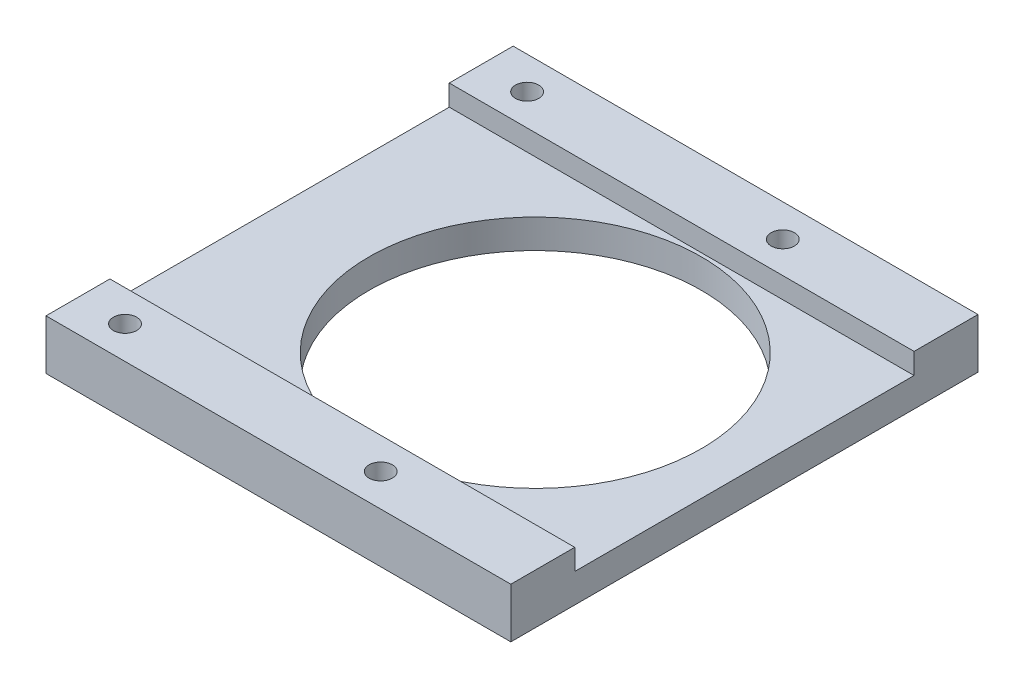
ISO-10303-21;
HEADER;
FILE_DESCRIPTION(('STEP AP214'),'2;1');
FILE_NAME('part.step','',(''),(''),'','','');
FILE_SCHEMA(('AUTOMOTIVE_DESIGN { 1 0 10303 214 1 1 1 1 }'));
ENDSEC;
DATA;
#1=APPLICATION_CONTEXT('core data for automotive mechanical design processes');
#2=APPLICATION_PROTOCOL_DEFINITION('international standard','automotive_design',2000,#1);
#3=PRODUCT_CONTEXT('',#1,'mechanical');
#4=PRODUCT('Part','Part','',(#3));
#5=PRODUCT_RELATED_PRODUCT_CATEGORY('part','',(#4));
#6=PRODUCT_DEFINITION_FORMATION('','',#4);
#7=PRODUCT_DEFINITION_CONTEXT('part definition',#1,'design');
#8=PRODUCT_DEFINITION('design','',#6,#7);
#9=PRODUCT_DEFINITION_SHAPE('','',#8);
#10=(LENGTH_UNIT() NAMED_UNIT(*) SI_UNIT(.MILLI.,.METRE.));
#11=(NAMED_UNIT(*) PLANE_ANGLE_UNIT() SI_UNIT($,.RADIAN.));
#12=(NAMED_UNIT(*) SI_UNIT($,.STERADIAN.) SOLID_ANGLE_UNIT());
#13=UNCERTAINTY_MEASURE_WITH_UNIT(LENGTH_MEASURE(1.E-05),#10,'distance_accuracy_value','');
#14=(GEOMETRIC_REPRESENTATION_CONTEXT(3) GLOBAL_UNCERTAINTY_ASSIGNED_CONTEXT((#13)) GLOBAL_UNIT_ASSIGNED_CONTEXT((#10,
#11,#12)) REPRESENTATION_CONTEXT('',''));
#15=CARTESIAN_POINT('',(0.,0.,0.));
#16=DIRECTION('',(0.,0.,1.));
#17=DIRECTION('',(1.,0.,0.));
#18=AXIS2_PLACEMENT_3D('',#15,#16,#17);
#19=CARTESIAN_POINT('',(0.,2.5,0.));
#20=DIRECTION('',(0.,1.,0.));
#21=DIRECTION('',(0.,0.,1.));
#22=AXIS2_PLACEMENT_3D('',#19,#20,#21);
#23=PLANE('',#22);
#24=CARTESIAN_POINT('',(0.,2.5,0.));
#25=DIRECTION('',(0.,1.,0.));
#26=DIRECTION('',(0.,0.,1.));
#27=AXIS2_PLACEMENT_3D('',#24,#25,#26);
#28=CIRCLE('',#27,14.3);
#29=CARTESIAN_POINT('',(0.,2.5,14.3));
#30=VERTEX_POINT('',#29);
#31=EDGE_CURVE('E151',#30,#30,#28,.T.);
#32=ORIENTED_EDGE('',*,*,#31,.F.);
#33=EDGE_LOOP('',(#32));
#34=FACE_BOUND('',#33,.T.);
#35=DIRECTION('',(0.,0.,1.));
#36=VECTOR('',#35,1.);
#37=CARTESIAN_POINT('',(-22.,2.5,-20.1));
#38=LINE('',#37,#36);
#39=CARTESIAN_POINT('',(-22.,2.5,-14.6));
#40=VERTEX_POINT('',#39);
#41=CARTESIAN_POINT('',(-22.,2.5,14.6));
#42=VERTEX_POINT('',#41);
#43=EDGE_CURVE('E49',#40,#42,#38,.T.);
#44=ORIENTED_EDGE('',*,*,#43,.T.);
#45=DIRECTION('',(-1.,0.,0.));
#46=VECTOR('',#45,1.);
#47=CARTESIAN_POINT('',(-22.,2.5,14.6));
#48=LINE('',#47,#46);
#49=CARTESIAN_POINT('',(18.,2.5,14.6));
#50=VERTEX_POINT('',#49);
#51=EDGE_CURVE('E118',#50,#42,#48,.T.);
#52=ORIENTED_EDGE('',*,*,#51,.F.);
#53=DIRECTION('',(0.,0.,-1.));
#54=VECTOR('',#53,1.);
#55=CARTESIAN_POINT('',(18.,2.5,-20.1));
#56=LINE('',#55,#54);
#57=CARTESIAN_POINT('',(18.,2.5,-14.6));
#58=VERTEX_POINT('',#57);
#59=EDGE_CURVE('E157',#50,#58,#56,.T.);
#60=ORIENTED_EDGE('',*,*,#59,.T.);
#61=DIRECTION('',(1.,0.,0.));
#62=VECTOR('',#61,1.);
#63=CARTESIAN_POINT('',(-22.,2.5,-14.6));
#64=LINE('',#63,#62);
#65=EDGE_CURVE('E54',#40,#58,#64,.T.);
#66=ORIENTED_EDGE('',*,*,#65,.F.);
#67=EDGE_LOOP('',(#44,#52,#60,#66));
#68=FACE_BOUND('',#67,.T.);
#69=ADVANCED_FACE('F34',(#34,#68),#23,.T.);
#70=CARTESIAN_POINT('',(0.,0.,0.));
#71=DIRECTION('',(0.,1.,0.));
#72=DIRECTION('',(0.,0.,1.));
#73=AXIS2_PLACEMENT_3D('',#70,#71,#72);
#74=PLANE('',#73);
#75=CARTESIAN_POINT('',(4.,0.,17.3));
#76=DIRECTION('',(0.,1.,0.));
#77=DIRECTION('',(0.,0.,1.));
#78=AXIS2_PLACEMENT_3D('',#75,#76,#77);
#79=CIRCLE('',#78,1.);
#80=CARTESIAN_POINT('',(4.,0.,18.3));
#81=VERTEX_POINT('',#80);
#82=EDGE_CURVE('E309',#81,#81,#79,.F.);
#83=ORIENTED_EDGE('',*,*,#82,.F.);
#84=EDGE_LOOP('',(#83));
#85=FACE_BOUND('',#84,.T.);
#86=CARTESIAN_POINT('',(-18.,0.,17.3));
#87=DIRECTION('',(0.,1.,0.));
#88=DIRECTION('',(0.,0.,1.));
#89=AXIS2_PLACEMENT_3D('',#86,#87,#88);
#90=CIRCLE('',#89,1.);
#91=CARTESIAN_POINT('',(-18.,0.,18.3));
#92=VERTEX_POINT('',#91);
#93=EDGE_CURVE('E303',#92,#92,#90,.F.);
#94=ORIENTED_EDGE('',*,*,#93,.F.);
#95=EDGE_LOOP('',(#94));
#96=FACE_BOUND('',#95,.T.);
#97=CARTESIAN_POINT('',(-18.,0.,-17.3));
#98=DIRECTION('',(0.,1.,0.));
#99=DIRECTION('',(0.,0.,1.));
#100=AXIS2_PLACEMENT_3D('',#97,#98,#99);
#101=CIRCLE('',#100,1.);
#102=CARTESIAN_POINT('',(-18.,0.,-16.3));
#103=VERTEX_POINT('',#102);
#104=EDGE_CURVE('E298',#103,#103,#101,.F.);
#105=ORIENTED_EDGE('',*,*,#104,.F.);
#106=EDGE_LOOP('',(#105));
#107=FACE_BOUND('',#106,.T.);
#108=CARTESIAN_POINT('',(4.,0.,-17.3));
#109=DIRECTION('',(0.,1.,0.));
#110=DIRECTION('',(0.,0.,1.));
#111=AXIS2_PLACEMENT_3D('',#108,#109,#110);
#112=CIRCLE('',#111,1.);
#113=CARTESIAN_POINT('',(4.,0.,-16.3));
#114=VERTEX_POINT('',#113);
#115=EDGE_CURVE('E120',#114,#114,#112,.F.);
#116=ORIENTED_EDGE('',*,*,#115,.F.);
#117=EDGE_LOOP('',(#116));
#118=FACE_BOUND('',#117,.T.);
#119=DIRECTION('',(0.,0.,1.));
#120=VECTOR('',#119,1.);
#121=CARTESIAN_POINT('',(-22.,0.,-20.1));
#122=LINE('',#121,#120);
#123=CARTESIAN_POINT('',(-22.,0.,-20.1));
#124=VERTEX_POINT('',#123);
#125=CARTESIAN_POINT('',(-22.,0.,20.1));
#126=VERTEX_POINT('',#125);
#127=EDGE_CURVE('E104',#124,#126,#122,.T.);
#128=ORIENTED_EDGE('',*,*,#127,.F.);
#129=DIRECTION('',(-1.,0.,0.));
#130=VECTOR('',#129,1.);
#131=CARTESIAN_POINT('',(-22.,0.,-20.1));
#132=LINE('',#131,#130);
#133=CARTESIAN_POINT('',(18.,0.,-20.1));
#134=VERTEX_POINT('',#133);
#135=EDGE_CURVE('E158',#134,#124,#132,.T.);
#136=ORIENTED_EDGE('',*,*,#135,.F.);
#137=DIRECTION('',(0.,0.,-1.));
#138=VECTOR('',#137,1.);
#139=CARTESIAN_POINT('',(18.,0.,-20.1));
#140=LINE('',#139,#138);
#141=CARTESIAN_POINT('',(18.,0.,20.1));
#142=VERTEX_POINT('',#141);
#143=EDGE_CURVE('E164',#142,#134,#140,.T.);
#144=ORIENTED_EDGE('',*,*,#143,.F.);
#145=DIRECTION('',(1.,0.,0.));
#146=VECTOR('',#145,1.);
#147=CARTESIAN_POINT('',(-22.,0.,20.1));
#148=LINE('',#147,#146);
#149=EDGE_CURVE('E162',#126,#142,#148,.T.);
#150=ORIENTED_EDGE('',*,*,#149,.F.);
#151=EDGE_LOOP('',(#128,#136,#144,#150));
#152=FACE_BOUND('',#151,.T.);
#153=CARTESIAN_POINT('',(0.,0.,0.));
#154=DIRECTION('',(0.,1.,0.));
#155=DIRECTION('',(0.,0.,1.));
#156=AXIS2_PLACEMENT_3D('',#153,#154,#155);
#157=CIRCLE('',#156,14.3);
#158=CARTESIAN_POINT('',(0.,0.,14.3));
#159=VERTEX_POINT('',#158);
#160=EDGE_CURVE('E150',#159,#159,#157,.T.);
#161=ORIENTED_EDGE('',*,*,#160,.T.);
#162=EDGE_LOOP('',(#161));
#163=FACE_BOUND('',#162,.T.);
#164=ADVANCED_FACE('F176',(#85,#96,#107,#118,#152,#163),#74,.F.);
#165=CARTESIAN_POINT('',(-22.,2.5,-20.1));
#166=DIRECTION('',(1.,0.,0.));
#167=DIRECTION('',(0.,0.,-1.));
#168=AXIS2_PLACEMENT_3D('',#165,#166,#167);
#169=PLANE('',#168);
#170=ORIENTED_EDGE('',*,*,#127,.T.);
#171=DIRECTION('',(0.,-1.,0.));
#172=VECTOR('',#171,1.);
#173=CARTESIAN_POINT('',(-22.,2.5,20.1));
#174=LINE('',#173,#172);
#175=CARTESIAN_POINT('',(-22.,4.3,20.1));
#176=VERTEX_POINT('',#175);
#177=EDGE_CURVE('E11',#176,#126,#174,.T.);
#178=ORIENTED_EDGE('',*,*,#177,.F.);
#179=DIRECTION('',(0.,0.,1.));
#180=VECTOR('',#179,1.);
#181=CARTESIAN_POINT('',(-22.,4.3,20.1));
#182=LINE('',#181,#180);
#183=CARTESIAN_POINT('',(-22.,4.3,14.6));
#184=VERTEX_POINT('',#183);
#185=EDGE_CURVE('E101',#184,#176,#182,.T.);
#186=ORIENTED_EDGE('',*,*,#185,.F.);
#187=DIRECTION('',(0.,-1.,0.));
#188=VECTOR('',#187,1.);
#189=CARTESIAN_POINT('',(-22.,4.3,14.6));
#190=LINE('',#189,#188);
#191=EDGE_CURVE('E126',#184,#42,#190,.T.);
#192=ORIENTED_EDGE('',*,*,#191,.T.);
#193=ORIENTED_EDGE('',*,*,#43,.F.);
#194=DIRECTION('',(0.,-1.,0.));
#195=VECTOR('',#194,1.);
#196=CARTESIAN_POINT('',(-22.,4.3,-14.6));
#197=LINE('',#196,#195);
#198=CARTESIAN_POINT('',(-22.,4.3,-14.6));
#199=VERTEX_POINT('',#198);
#200=EDGE_CURVE('E147',#199,#40,#197,.T.);
#201=ORIENTED_EDGE('',*,*,#200,.F.);
#202=DIRECTION('',(0.,0.,1.));
#203=VECTOR('',#202,1.);
#204=CARTESIAN_POINT('',(-22.,4.3,-20.1));
#205=LINE('',#204,#203);
#206=CARTESIAN_POINT('',(-22.,4.3,-20.1));
#207=VERTEX_POINT('',#206);
#208=EDGE_CURVE('E132',#207,#199,#205,.T.);
#209=ORIENTED_EDGE('',*,*,#208,.F.);
#210=DIRECTION('',(0.,-1.,0.));
#211=VECTOR('',#210,1.);
#212=CARTESIAN_POINT('',(-22.,2.5,-20.1));
#213=LINE('',#212,#211);
#214=EDGE_CURVE('E160',#207,#124,#213,.T.);
#215=ORIENTED_EDGE('',*,*,#214,.T.);
#216=EDGE_LOOP('',(#170,#178,#186,#192,#193,#201,#209,#215));
#217=FACE_BOUND('',#216,.T.);
#218=ADVANCED_FACE('F36',(#217),#169,.F.);
#219=CARTESIAN_POINT('',(-22.,2.5,20.1));
#220=DIRECTION('',(0.,0.,-1.));
#221=DIRECTION('',(-1.,0.,0.));
#222=AXIS2_PLACEMENT_3D('',#219,#220,#221);
#223=PLANE('',#222);
#224=ORIENTED_EDGE('',*,*,#149,.T.);
#225=DIRECTION('',(0.,-1.,0.));
#226=VECTOR('',#225,1.);
#227=CARTESIAN_POINT('',(18.,2.5,20.1));
#228=LINE('',#227,#226);
#229=CARTESIAN_POINT('',(18.,4.3,20.1));
#230=VERTEX_POINT('',#229);
#231=EDGE_CURVE('E42',#230,#142,#228,.T.);
#232=ORIENTED_EDGE('',*,*,#231,.F.);
#233=DIRECTION('',(1.,0.,0.));
#234=VECTOR('',#233,1.);
#235=CARTESIAN_POINT('',(-22.,4.3,20.1));
#236=LINE('',#235,#234);
#237=EDGE_CURVE('E107',#176,#230,#236,.T.);
#238=ORIENTED_EDGE('',*,*,#237,.F.);
#239=ORIENTED_EDGE('',*,*,#177,.T.);
#240=EDGE_LOOP('',(#224,#232,#238,#239));
#241=FACE_BOUND('',#240,.T.);
#242=ADVANCED_FACE('F108',(#241),#223,.F.);
#243=CARTESIAN_POINT('',(18.,2.5,-20.1));
#244=DIRECTION('',(-1.,0.,0.));
#245=DIRECTION('',(0.,0.,1.));
#246=AXIS2_PLACEMENT_3D('',#243,#244,#245);
#247=PLANE('',#246);
#248=ORIENTED_EDGE('',*,*,#143,.T.);
#249=DIRECTION('',(0.,-1.,0.));
#250=VECTOR('',#249,1.);
#251=CARTESIAN_POINT('',(18.,2.5,-20.1));
#252=LINE('',#251,#250);
#253=CARTESIAN_POINT('',(18.,4.3,-20.1));
#254=VERTEX_POINT('',#253);
#255=EDGE_CURVE('E168',#254,#134,#252,.T.);
#256=ORIENTED_EDGE('',*,*,#255,.F.);
#257=DIRECTION('',(0.,0.,-1.));
#258=VECTOR('',#257,1.);
#259=CARTESIAN_POINT('',(18.,4.3,-20.1));
#260=LINE('',#259,#258);
#261=CARTESIAN_POINT('',(18.,4.3,-14.6));
#262=VERTEX_POINT('',#261);
#263=EDGE_CURVE('E137',#262,#254,#260,.T.);
#264=ORIENTED_EDGE('',*,*,#263,.F.);
#265=DIRECTION('',(0.,-1.,0.));
#266=VECTOR('',#265,1.);
#267=CARTESIAN_POINT('',(18.,4.3,-14.6));
#268=LINE('',#267,#266);
#269=EDGE_CURVE('E143',#262,#58,#268,.T.);
#270=ORIENTED_EDGE('',*,*,#269,.T.);
#271=ORIENTED_EDGE('',*,*,#59,.F.);
#272=DIRECTION('',(0.,-1.,0.));
#273=VECTOR('',#272,1.);
#274=CARTESIAN_POINT('',(18.,4.3,14.6));
#275=LINE('',#274,#273);
#276=CARTESIAN_POINT('',(18.,4.3,14.6));
#277=VERTEX_POINT('',#276);
#278=EDGE_CURVE('E129',#277,#50,#275,.T.);
#279=ORIENTED_EDGE('',*,*,#278,.F.);
#280=DIRECTION('',(0.,0.,-1.));
#281=VECTOR('',#280,1.);
#282=CARTESIAN_POINT('',(18.,4.3,20.1));
#283=LINE('',#282,#281);
#284=EDGE_CURVE('E112',#230,#277,#283,.T.);
#285=ORIENTED_EDGE('',*,*,#284,.F.);
#286=ORIENTED_EDGE('',*,*,#231,.T.);
#287=EDGE_LOOP('',(#248,#256,#264,#270,#271,#279,#285,#286));
#288=FACE_BOUND('',#287,.T.);
#289=ADVANCED_FACE('F172',(#288),#247,.F.);
#290=CARTESIAN_POINT('',(-22.,2.5,-20.1));
#291=DIRECTION('',(0.,0.,1.));
#292=DIRECTION('',(1.,0.,0.));
#293=AXIS2_PLACEMENT_3D('',#290,#291,#292);
#294=PLANE('',#293);
#295=ORIENTED_EDGE('',*,*,#135,.T.);
#296=ORIENTED_EDGE('',*,*,#214,.F.);
#297=DIRECTION('',(-1.,0.,0.));
#298=VECTOR('',#297,1.);
#299=CARTESIAN_POINT('',(-22.,4.3,-20.1));
#300=LINE('',#299,#298);
#301=EDGE_CURVE('E140',#254,#207,#300,.T.);
#302=ORIENTED_EDGE('',*,*,#301,.F.);
#303=ORIENTED_EDGE('',*,*,#255,.T.);
#304=EDGE_LOOP('',(#295,#296,#302,#303));
#305=FACE_BOUND('',#304,.T.);
#306=ADVANCED_FACE('F179',(#305),#294,.F.);
#307=CARTESIAN_POINT('',(0.,2.5,0.));
#308=DIRECTION('',(0.,-1.,0.));
#309=DIRECTION('',(0.,0.,-1.));
#310=AXIS2_PLACEMENT_3D('',#307,#308,#309);
#311=CYLINDRICAL_SURFACE('',#310,14.3);
#312=ORIENTED_EDGE('',*,*,#31,.T.);
#313=EDGE_LOOP('',(#312));
#314=FACE_BOUND('',#313,.T.);
#315=ORIENTED_EDGE('',*,*,#160,.F.);
#316=EDGE_LOOP('',(#315));
#317=FACE_BOUND('',#316,.T.);
#318=ADVANCED_FACE('F190',(#314,#317),#311,.F.);
#319=CARTESIAN_POINT('',(-22.,4.3,-14.6));
#320=DIRECTION('',(0.,0.,-1.));
#321=DIRECTION('',(-1.,0.,0.));
#322=AXIS2_PLACEMENT_3D('',#319,#320,#321);
#323=PLANE('',#322);
#324=ORIENTED_EDGE('',*,*,#65,.T.);
#325=ORIENTED_EDGE('',*,*,#269,.F.);
#326=DIRECTION('',(1.,0.,0.));
#327=VECTOR('',#326,1.);
#328=CARTESIAN_POINT('',(-22.,4.3,-14.6));
#329=LINE('',#328,#327);
#330=EDGE_CURVE('E135',#199,#262,#329,.T.);
#331=ORIENTED_EDGE('',*,*,#330,.F.);
#332=ORIENTED_EDGE('',*,*,#200,.T.);
#333=EDGE_LOOP('',(#324,#325,#331,#332));
#334=FACE_BOUND('',#333,.T.);
#335=ADVANCED_FACE('F188',(#334),#323,.F.);
#336=CARTESIAN_POINT('',(0.,4.3,0.));
#337=DIRECTION('',(0.,1.,0.));
#338=DIRECTION('',(0.,0.,1.));
#339=AXIS2_PLACEMENT_3D('',#336,#337,#338);
#340=PLANE('',#339);
#341=CARTESIAN_POINT('',(-18.,4.3,-17.3));
#342=DIRECTION('',(0.,1.,0.));
#343=DIRECTION('',(0.,0.,1.));
#344=AXIS2_PLACEMENT_3D('',#341,#342,#343);
#345=CIRCLE('',#344,1.);
#346=CARTESIAN_POINT('',(-18.,4.3,-16.3));
#347=VERTEX_POINT('',#346);
#348=EDGE_CURVE('E295',#347,#347,#345,.T.);
#349=ORIENTED_EDGE('',*,*,#348,.F.);
#350=EDGE_LOOP('',(#349));
#351=FACE_BOUND('',#350,.T.);
#352=CARTESIAN_POINT('',(4.,4.3,-17.3));
#353=DIRECTION('',(0.,1.,0.));
#354=DIRECTION('',(0.,0.,1.));
#355=AXIS2_PLACEMENT_3D('',#352,#353,#354);
#356=CIRCLE('',#355,1.);
#357=CARTESIAN_POINT('',(4.,4.3,-16.3));
#358=VERTEX_POINT('',#357);
#359=EDGE_CURVE('E300',#358,#358,#356,.T.);
#360=ORIENTED_EDGE('',*,*,#359,.F.);
#361=EDGE_LOOP('',(#360));
#362=FACE_BOUND('',#361,.T.);
#363=ORIENTED_EDGE('',*,*,#208,.T.);
#364=ORIENTED_EDGE('',*,*,#330,.T.);
#365=ORIENTED_EDGE('',*,*,#263,.T.);
#366=ORIENTED_EDGE('',*,*,#301,.T.);
#367=EDGE_LOOP('',(#363,#364,#365,#366));
#368=FACE_BOUND('',#367,.T.);
#369=ADVANCED_FACE('F184',(#351,#362,#368),#340,.T.);
#370=CARTESIAN_POINT('',(-22.,4.3,14.6));
#371=DIRECTION('',(0.,0.,1.));
#372=DIRECTION('',(1.,0.,0.));
#373=AXIS2_PLACEMENT_3D('',#370,#371,#372);
#374=PLANE('',#373);
#375=ORIENTED_EDGE('',*,*,#51,.T.);
#376=ORIENTED_EDGE('',*,*,#191,.F.);
#377=DIRECTION('',(-1.,0.,0.));
#378=VECTOR('',#377,1.);
#379=CARTESIAN_POINT('',(-22.,4.3,14.6));
#380=LINE('',#379,#378);
#381=EDGE_CURVE('E116',#277,#184,#380,.T.);
#382=ORIENTED_EDGE('',*,*,#381,.F.);
#383=ORIENTED_EDGE('',*,*,#278,.T.);
#384=EDGE_LOOP('',(#375,#376,#382,#383));
#385=FACE_BOUND('',#384,.T.);
#386=ADVANCED_FACE('F196',(#385),#374,.F.);
#387=CARTESIAN_POINT('',(0.,4.3,0.));
#388=DIRECTION('',(0.,-1.,0.));
#389=DIRECTION('',(0.,0.,-1.));
#390=AXIS2_PLACEMENT_3D('',#387,#388,#389);
#391=PLANE('',#390);
#392=CARTESIAN_POINT('',(4.,4.3,17.3));
#393=DIRECTION('',(0.,1.,0.));
#394=DIRECTION('',(0.,0.,-1.));
#395=AXIS2_PLACEMENT_3D('',#392,#393,#394);
#396=CIRCLE('',#395,1.);
#397=CARTESIAN_POINT('',(4.,4.3,16.3));
#398=VERTEX_POINT('',#397);
#399=EDGE_CURVE('E312',#398,#398,#396,.T.);
#400=ORIENTED_EDGE('',*,*,#399,.F.);
#401=EDGE_LOOP('',(#400));
#402=FACE_BOUND('',#401,.T.);
#403=CARTESIAN_POINT('',(-18.,4.3,17.3));
#404=DIRECTION('',(0.,1.,0.));
#405=DIRECTION('',(0.,0.,-1.));
#406=AXIS2_PLACEMENT_3D('',#403,#404,#405);
#407=CIRCLE('',#406,1.);
#408=CARTESIAN_POINT('',(-18.,4.3,16.3));
#409=VERTEX_POINT('',#408);
#410=EDGE_CURVE('E306',#409,#409,#407,.T.);
#411=ORIENTED_EDGE('',*,*,#410,.F.);
#412=EDGE_LOOP('',(#411));
#413=FACE_BOUND('',#412,.T.);
#414=ORIENTED_EDGE('',*,*,#185,.T.);
#415=ORIENTED_EDGE('',*,*,#237,.T.);
#416=ORIENTED_EDGE('',*,*,#284,.T.);
#417=ORIENTED_EDGE('',*,*,#381,.T.);
#418=EDGE_LOOP('',(#414,#415,#416,#417));
#419=FACE_BOUND('',#418,.T.);
#420=ADVANCED_FACE('F114',(#402,#413,#419),#391,.F.);
#421=CARTESIAN_POINT('',(-18.,-0.00100000000000013,17.3));
#422=DIRECTION('',(0.,1.,0.));
#423=DIRECTION('',(0.,0.,1.));
#424=AXIS2_PLACEMENT_3D('',#421,#422,#423);
#425=CYLINDRICAL_SURFACE('',#424,1.);
#426=ORIENTED_EDGE('',*,*,#410,.T.);
#427=EDGE_LOOP('',(#426));
#428=FACE_BOUND('',#427,.T.);
#429=ORIENTED_EDGE('',*,*,#93,.T.);
#430=EDGE_LOOP('',(#429));
#431=FACE_BOUND('',#430,.T.);
#432=ADVANCED_FACE('F245',(#428,#431),#425,.F.);
#433=CARTESIAN_POINT('',(4.,-0.00100000000000013,17.3));
#434=DIRECTION('',(0.,1.,0.));
#435=DIRECTION('',(0.,0.,1.));
#436=AXIS2_PLACEMENT_3D('',#433,#434,#435);
#437=CYLINDRICAL_SURFACE('',#436,1.);
#438=ORIENTED_EDGE('',*,*,#399,.T.);
#439=EDGE_LOOP('',(#438));
#440=FACE_BOUND('',#439,.T.);
#441=ORIENTED_EDGE('',*,*,#82,.T.);
#442=EDGE_LOOP('',(#441));
#443=FACE_BOUND('',#442,.T.);
#444=ADVANCED_FACE('F255',(#440,#443),#437,.F.);
#445=CARTESIAN_POINT('',(4.,-0.00100000000000013,-17.3));
#446=DIRECTION('',(0.,1.,0.));
#447=DIRECTION('',(0.,0.,1.));
#448=AXIS2_PLACEMENT_3D('',#445,#446,#447);
#449=CYLINDRICAL_SURFACE('',#448,1.);
#450=ORIENTED_EDGE('',*,*,#359,.T.);
#451=EDGE_LOOP('',(#450));
#452=FACE_BOUND('',#451,.T.);
#453=ORIENTED_EDGE('',*,*,#115,.T.);
#454=EDGE_LOOP('',(#453));
#455=FACE_BOUND('',#454,.T.);
#456=ADVANCED_FACE('F265',(#452,#455),#449,.F.);
#457=CARTESIAN_POINT('',(-18.,-0.00100000000000013,-17.3));
#458=DIRECTION('',(0.,1.,0.));
#459=DIRECTION('',(0.,0.,1.));
#460=AXIS2_PLACEMENT_3D('',#457,#458,#459);
#461=CYLINDRICAL_SURFACE('',#460,1.);
#462=ORIENTED_EDGE('',*,*,#348,.T.);
#463=EDGE_LOOP('',(#462));
#464=FACE_BOUND('',#463,.T.);
#465=ORIENTED_EDGE('',*,*,#104,.T.);
#466=EDGE_LOOP('',(#465));
#467=FACE_BOUND('',#466,.T.);
#468=ADVANCED_FACE('F275',(#464,#467),#461,.F.);
#469=CLOSED_SHELL('',(#69,#164,#218,#242,#289,#306,#318,#335,#369,#386,#420,#432,#444,#456,#468));
#470=MANIFOLD_SOLID_BREP('B2',#469);
#471=ADVANCED_BREP_SHAPE_REPRESENTATION('',(#18,#470),#14);
#472=SHAPE_DEFINITION_REPRESENTATION(#9,#471);
ENDSEC;
END-ISO-10303-21;
